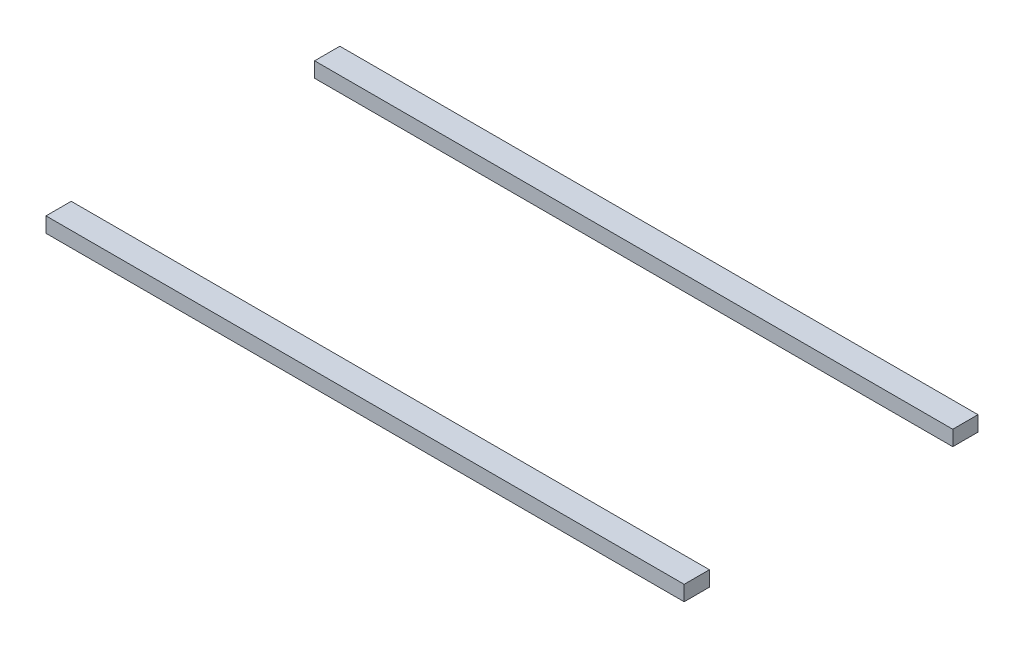
ISO-10303-21;
HEADER;
FILE_DESCRIPTION(('STEP AP214'),'2;1');
FILE_NAME('part.step','',(''),(''),'','','');
FILE_SCHEMA(('AUTOMOTIVE_DESIGN { 1 0 10303 214 1 1 1 1 }'));
ENDSEC;
DATA;
#1=APPLICATION_CONTEXT('core data for automotive mechanical design processes');
#2=APPLICATION_PROTOCOL_DEFINITION('international standard','automotive_design',2000,#1);
#3=PRODUCT_CONTEXT('',#1,'mechanical');
#4=PRODUCT('Part','Part','',(#3));
#5=PRODUCT_RELATED_PRODUCT_CATEGORY('part','',(#4));
#6=PRODUCT_DEFINITION_FORMATION('','',#4);
#7=PRODUCT_DEFINITION_CONTEXT('part definition',#1,'design');
#8=PRODUCT_DEFINITION('design','',#6,#7);
#9=PRODUCT_DEFINITION_SHAPE('','',#8);
#10=(LENGTH_UNIT() NAMED_UNIT(*) SI_UNIT(.MILLI.,.METRE.));
#11=(NAMED_UNIT(*) PLANE_ANGLE_UNIT() SI_UNIT($,.RADIAN.));
#12=(NAMED_UNIT(*) SI_UNIT($,.STERADIAN.) SOLID_ANGLE_UNIT());
#13=UNCERTAINTY_MEASURE_WITH_UNIT(LENGTH_MEASURE(1.E-05),#10,'distance_accuracy_value','');
#14=(GEOMETRIC_REPRESENTATION_CONTEXT(3) GLOBAL_UNCERTAINTY_ASSIGNED_CONTEXT((#13)) GLOBAL_UNIT_ASSIGNED_CONTEXT((#10,
#11,#12)) REPRESENTATION_CONTEXT('',''));
#15=CARTESIAN_POINT('',(0.,0.,0.));
#16=DIRECTION('',(0.,0.,1.));
#17=DIRECTION('',(1.,0.,0.));
#18=AXIS2_PLACEMENT_3D('',#15,#16,#17);
#19=CARTESIAN_POINT('',(0.,30.,-241.));
#20=DIRECTION('',(0.,0.,-1.));
#21=DIRECTION('',(-1.,0.,0.));
#22=AXIS2_PLACEMENT_3D('',#19,#20,#21);
#23=PLANE('',#22);
#24=DIRECTION('',(1.,0.,0.));
#25=VECTOR('',#24,1.);
#26=CARTESIAN_POINT('',(0.,0.,-241.));
#27=LINE('',#26,#25);
#28=CARTESIAN_POINT('',(-632.,0.,-241.));
#29=VERTEX_POINT('',#28);
#30=CARTESIAN_POINT('',(632.,0.,-241.));
#31=VERTEX_POINT('',#30);
#32=EDGE_CURVE('E106',#29,#31,#27,.T.);
#33=ORIENTED_EDGE('',*,*,#32,.T.);
#34=DIRECTION('',(0.,-1.,0.));
#35=VECTOR('',#34,1.);
#36=CARTESIAN_POINT('',(632.,30.,-241.));
#37=LINE('',#36,#35);
#38=CARTESIAN_POINT('',(632.,30.,-241.));
#39=VERTEX_POINT('',#38);
#40=EDGE_CURVE('E12',#39,#31,#37,.T.);
#41=ORIENTED_EDGE('',*,*,#40,.F.);
#42=DIRECTION('',(1.,0.,0.));
#43=VECTOR('',#42,1.);
#44=CARTESIAN_POINT('',(0.,30.,-241.));
#45=LINE('',#44,#43);
#46=CARTESIAN_POINT('',(-632.,30.,-241.));
#47=VERTEX_POINT('',#46);
#48=EDGE_CURVE('E92',#47,#39,#45,.T.);
#49=ORIENTED_EDGE('',*,*,#48,.F.);
#50=DIRECTION('',(0.,-1.,0.));
#51=VECTOR('',#50,1.);
#52=CARTESIAN_POINT('',(-632.,30.,-241.));
#53=LINE('',#52,#51);
#54=EDGE_CURVE('E59',#47,#29,#53,.T.);
#55=ORIENTED_EDGE('',*,*,#54,.T.);
#56=EDGE_LOOP('',(#33,#41,#49,#55));
#57=FACE_BOUND('',#56,.T.);
#58=ADVANCED_FACE('F43',(#57),#23,.F.);
#59=CARTESIAN_POINT('',(632.,30.,0.));
#60=DIRECTION('',(-1.,0.,0.));
#61=DIRECTION('',(0.,0.,1.));
#62=AXIS2_PLACEMENT_3D('',#59,#60,#61);
#63=PLANE('',#62);
#64=DIRECTION('',(0.,0.,-1.));
#65=VECTOR('',#64,1.);
#66=CARTESIAN_POINT('',(632.,0.,0.));
#67=LINE('',#66,#65);
#68=CARTESIAN_POINT('',(632.,0.,-291.));
#69=VERTEX_POINT('',#68);
#70=EDGE_CURVE('E97',#31,#69,#67,.T.);
#71=ORIENTED_EDGE('',*,*,#70,.T.);
#72=DIRECTION('',(0.,-1.,0.));
#73=VECTOR('',#72,1.);
#74=CARTESIAN_POINT('',(632.,30.,-291.));
#75=LINE('',#74,#73);
#76=CARTESIAN_POINT('',(632.,30.,-291.));
#77=VERTEX_POINT('',#76);
#78=EDGE_CURVE('E51',#77,#69,#75,.T.);
#79=ORIENTED_EDGE('',*,*,#78,.F.);
#80=DIRECTION('',(0.,0.,-1.));
#81=VECTOR('',#80,1.);
#82=CARTESIAN_POINT('',(632.,30.,0.));
#83=LINE('',#82,#81);
#84=EDGE_CURVE('E84',#39,#77,#83,.T.);
#85=ORIENTED_EDGE('',*,*,#84,.F.);
#86=ORIENTED_EDGE('',*,*,#40,.T.);
#87=EDGE_LOOP('',(#71,#79,#85,#86));
#88=FACE_BOUND('',#87,.T.);
#89=ADVANCED_FACE('F96',(#88),#63,.F.);
#90=CARTESIAN_POINT('',(0.,30.,-291.));
#91=DIRECTION('',(0.,0.,-1.));
#92=DIRECTION('',(-1.,0.,0.));
#93=AXIS2_PLACEMENT_3D('',#90,#91,#92);
#94=PLANE('',#93);
#95=DIRECTION('',(1.,0.,0.));
#96=VECTOR('',#95,1.);
#97=CARTESIAN_POINT('',(0.,0.,-291.));
#98=LINE('',#97,#96);
#99=CARTESIAN_POINT('',(-632.,0.,-291.));
#100=VERTEX_POINT('',#99);
#101=EDGE_CURVE('E109',#100,#69,#98,.T.);
#102=ORIENTED_EDGE('',*,*,#101,.F.);
#103=DIRECTION('',(0.,-1.,0.));
#104=VECTOR('',#103,1.);
#105=CARTESIAN_POINT('',(-632.,30.,-291.));
#106=LINE('',#105,#104);
#107=CARTESIAN_POINT('',(-632.,30.,-291.));
#108=VERTEX_POINT('',#107);
#109=EDGE_CURVE('E73',#108,#100,#106,.T.);
#110=ORIENTED_EDGE('',*,*,#109,.F.);
#111=DIRECTION('',(1.,0.,0.));
#112=VECTOR('',#111,1.);
#113=CARTESIAN_POINT('',(0.,30.,-291.));
#114=LINE('',#113,#112);
#115=EDGE_CURVE('E91',#108,#77,#114,.T.);
#116=ORIENTED_EDGE('',*,*,#115,.T.);
#117=ORIENTED_EDGE('',*,*,#78,.T.);
#118=EDGE_LOOP('',(#102,#110,#116,#117));
#119=FACE_BOUND('',#118,.T.);
#120=ADVANCED_FACE('F100',(#119),#94,.T.);
#121=CARTESIAN_POINT('',(-632.,30.,0.));
#122=DIRECTION('',(-1.,0.,0.));
#123=DIRECTION('',(0.,0.,1.));
#124=AXIS2_PLACEMENT_3D('',#121,#122,#123);
#125=PLANE('',#124);
#126=DIRECTION('',(0.,0.,-1.));
#127=VECTOR('',#126,1.);
#128=CARTESIAN_POINT('',(-632.,0.,0.));
#129=LINE('',#128,#127);
#130=EDGE_CURVE('E111',#29,#100,#129,.T.);
#131=ORIENTED_EDGE('',*,*,#130,.F.);
#132=ORIENTED_EDGE('',*,*,#54,.F.);
#133=DIRECTION('',(0.,0.,-1.));
#134=VECTOR('',#133,1.);
#135=CARTESIAN_POINT('',(-632.,30.,0.));
#136=LINE('',#135,#134);
#137=EDGE_CURVE('E101',#47,#108,#136,.T.);
#138=ORIENTED_EDGE('',*,*,#137,.T.);
#139=ORIENTED_EDGE('',*,*,#109,.T.);
#140=EDGE_LOOP('',(#131,#132,#138,#139));
#141=FACE_BOUND('',#140,.T.);
#142=ADVANCED_FACE('F117',(#141),#125,.T.);
#143=CARTESIAN_POINT('',(0.,30.,0.));
#144=DIRECTION('',(0.,1.,0.));
#145=DIRECTION('',(0.,0.,1.));
#146=AXIS2_PLACEMENT_3D('',#143,#144,#145);
#147=PLANE('',#146);
#148=ORIENTED_EDGE('',*,*,#48,.T.);
#149=ORIENTED_EDGE('',*,*,#84,.T.);
#150=ORIENTED_EDGE('',*,*,#115,.F.);
#151=ORIENTED_EDGE('',*,*,#137,.F.);
#152=EDGE_LOOP('',(#148,#149,#150,#151));
#153=FACE_BOUND('',#152,.T.);
#154=ADVANCED_FACE('F88',(#153),#147,.T.);
#155=CARTESIAN_POINT('',(0.,0.,0.));
#156=DIRECTION('',(0.,1.,0.));
#157=DIRECTION('',(0.,0.,1.));
#158=AXIS2_PLACEMENT_3D('',#155,#156,#157);
#159=PLANE('',#158);
#160=ORIENTED_EDGE('',*,*,#32,.F.);
#161=ORIENTED_EDGE('',*,*,#130,.T.);
#162=ORIENTED_EDGE('',*,*,#101,.T.);
#163=ORIENTED_EDGE('',*,*,#70,.F.);
#164=EDGE_LOOP('',(#160,#161,#162,#163));
#165=FACE_BOUND('',#164,.T.);
#166=ADVANCED_FACE('F116',(#165),#159,.F.);
#167=CLOSED_SHELL('',(#58,#89,#120,#142,#154,#166));
#168=MANIFOLD_SOLID_BREP('B2',#167);
#169=CARTESIAN_POINT('',(0.,30.,241.));
#170=DIRECTION('',(0.,0.,-1.));
#171=DIRECTION('',(-1.,0.,0.));
#172=AXIS2_PLACEMENT_3D('',#169,#170,#171);
#173=PLANE('',#172);
#174=DIRECTION('',(1.,0.,0.));
#175=VECTOR('',#174,1.);
#176=CARTESIAN_POINT('',(0.,0.,241.));
#177=LINE('',#176,#175);
#178=CARTESIAN_POINT('',(-632.,0.,241.));
#179=VERTEX_POINT('',#178);
#180=CARTESIAN_POINT('',(632.,0.,241.));
#181=VERTEX_POINT('',#180);
#182=EDGE_CURVE('E230',#179,#181,#177,.T.);
#183=ORIENTED_EDGE('',*,*,#182,.F.);
#184=DIRECTION('',(0.,-1.,0.));
#185=VECTOR('',#184,1.);
#186=CARTESIAN_POINT('',(-632.,30.,241.));
#187=LINE('',#186,#185);
#188=CARTESIAN_POINT('',(-632.,30.,241.));
#189=VERTEX_POINT('',#188);
#190=EDGE_CURVE('E41',#189,#179,#187,.T.);
#191=ORIENTED_EDGE('',*,*,#190,.F.);
#192=DIRECTION('',(1.,0.,0.));
#193=VECTOR('',#192,1.);
#194=CARTESIAN_POINT('',(0.,30.,241.));
#195=LINE('',#194,#193);
#196=CARTESIAN_POINT('',(632.,30.,241.));
#197=VERTEX_POINT('',#196);
#198=EDGE_CURVE('E224',#189,#197,#195,.T.);
#199=ORIENTED_EDGE('',*,*,#198,.T.);
#200=DIRECTION('',(0.,-1.,0.));
#201=VECTOR('',#200,1.);
#202=CARTESIAN_POINT('',(632.,30.,241.));
#203=LINE('',#202,#201);
#204=EDGE_CURVE('E205',#197,#181,#203,.T.);
#205=ORIENTED_EDGE('',*,*,#204,.T.);
#206=EDGE_LOOP('',(#183,#191,#199,#205));
#207=FACE_BOUND('',#206,.T.);
#208=ADVANCED_FACE('F167',(#207),#173,.T.);
#209=CARTESIAN_POINT('',(-632.,30.,0.));
#210=DIRECTION('',(-1.,0.,0.));
#211=DIRECTION('',(0.,0.,1.));
#212=AXIS2_PLACEMENT_3D('',#209,#210,#211);
#213=PLANE('',#212);
#214=DIRECTION('',(0.,0.,-1.));
#215=VECTOR('',#214,1.);
#216=CARTESIAN_POINT('',(-632.,0.,0.));
#217=LINE('',#216,#215);
#218=CARTESIAN_POINT('',(-632.,0.,291.));
#219=VERTEX_POINT('',#218);
#220=EDGE_CURVE('E218',#219,#179,#217,.T.);
#221=ORIENTED_EDGE('',*,*,#220,.F.);
#222=DIRECTION('',(0.,-1.,0.));
#223=VECTOR('',#222,1.);
#224=CARTESIAN_POINT('',(-632.,30.,291.));
#225=LINE('',#224,#223);
#226=CARTESIAN_POINT('',(-632.,30.,291.));
#227=VERTEX_POINT('',#226);
#228=EDGE_CURVE('E175',#227,#219,#225,.T.);
#229=ORIENTED_EDGE('',*,*,#228,.F.);
#230=DIRECTION('',(0.,0.,-1.));
#231=VECTOR('',#230,1.);
#232=CARTESIAN_POINT('',(-632.,30.,0.));
#233=LINE('',#232,#231);
#234=EDGE_CURVE('E216',#227,#189,#233,.T.);
#235=ORIENTED_EDGE('',*,*,#234,.T.);
#236=ORIENTED_EDGE('',*,*,#190,.T.);
#237=EDGE_LOOP('',(#221,#229,#235,#236));
#238=FACE_BOUND('',#237,.T.);
#239=ADVANCED_FACE('F214',(#238),#213,.T.);
#240=CARTESIAN_POINT('',(0.,30.,291.));
#241=DIRECTION('',(0.,0.,-1.));
#242=DIRECTION('',(-1.,0.,0.));
#243=AXIS2_PLACEMENT_3D('',#240,#241,#242);
#244=PLANE('',#243);
#245=DIRECTION('',(1.,0.,0.));
#246=VECTOR('',#245,1.);
#247=CARTESIAN_POINT('',(0.,0.,291.));
#248=LINE('',#247,#246);
#249=CARTESIAN_POINT('',(632.,0.,291.));
#250=VERTEX_POINT('',#249);
#251=EDGE_CURVE('E198',#219,#250,#248,.T.);
#252=ORIENTED_EDGE('',*,*,#251,.T.);
#253=DIRECTION('',(0.,-1.,0.));
#254=VECTOR('',#253,1.);
#255=CARTESIAN_POINT('',(632.,30.,291.));
#256=LINE('',#255,#254);
#257=CARTESIAN_POINT('',(632.,30.,291.));
#258=VERTEX_POINT('',#257);
#259=EDGE_CURVE('E219',#258,#250,#256,.T.);
#260=ORIENTED_EDGE('',*,*,#259,.F.);
#261=DIRECTION('',(1.,0.,0.));
#262=VECTOR('',#261,1.);
#263=CARTESIAN_POINT('',(0.,30.,291.));
#264=LINE('',#263,#262);
#265=EDGE_CURVE('E220',#227,#258,#264,.T.);
#266=ORIENTED_EDGE('',*,*,#265,.F.);
#267=ORIENTED_EDGE('',*,*,#228,.T.);
#268=EDGE_LOOP('',(#252,#260,#266,#267));
#269=FACE_BOUND('',#268,.T.);
#270=ADVANCED_FACE('F221',(#269),#244,.F.);
#271=CARTESIAN_POINT('',(632.,30.,0.));
#272=DIRECTION('',(-1.,0.,0.));
#273=DIRECTION('',(0.,0.,1.));
#274=AXIS2_PLACEMENT_3D('',#271,#272,#273);
#275=PLANE('',#274);
#276=DIRECTION('',(0.,0.,-1.));
#277=VECTOR('',#276,1.);
#278=CARTESIAN_POINT('',(632.,0.,0.));
#279=LINE('',#278,#277);
#280=EDGE_CURVE('E226',#250,#181,#279,.T.);
#281=ORIENTED_EDGE('',*,*,#280,.T.);
#282=ORIENTED_EDGE('',*,*,#204,.F.);
#283=DIRECTION('',(0.,0.,-1.));
#284=VECTOR('',#283,1.);
#285=CARTESIAN_POINT('',(632.,30.,0.));
#286=LINE('',#285,#284);
#287=EDGE_CURVE('E183',#258,#197,#286,.T.);
#288=ORIENTED_EDGE('',*,*,#287,.F.);
#289=ORIENTED_EDGE('',*,*,#259,.T.);
#290=EDGE_LOOP('',(#281,#282,#288,#289));
#291=FACE_BOUND('',#290,.T.);
#292=ADVANCED_FACE('F239',(#291),#275,.F.);
#293=CARTESIAN_POINT('',(0.,30.,0.));
#294=DIRECTION('',(0.,1.,0.));
#295=DIRECTION('',(0.,0.,1.));
#296=AXIS2_PLACEMENT_3D('',#293,#294,#295);
#297=PLANE('',#296);
#298=ORIENTED_EDGE('',*,*,#198,.F.);
#299=ORIENTED_EDGE('',*,*,#234,.F.);
#300=ORIENTED_EDGE('',*,*,#265,.T.);
#301=ORIENTED_EDGE('',*,*,#287,.T.);
#302=EDGE_LOOP('',(#298,#299,#300,#301));
#303=FACE_BOUND('',#302,.T.);
#304=ADVANCED_FACE('F223',(#303),#297,.T.);
#305=CARTESIAN_POINT('',(0.,0.,0.));
#306=DIRECTION('',(0.,1.,0.));
#307=DIRECTION('',(0.,0.,1.));
#308=AXIS2_PLACEMENT_3D('',#305,#306,#307);
#309=PLANE('',#308);
#310=ORIENTED_EDGE('',*,*,#182,.T.);
#311=ORIENTED_EDGE('',*,*,#280,.F.);
#312=ORIENTED_EDGE('',*,*,#251,.F.);
#313=ORIENTED_EDGE('',*,*,#220,.T.);
#314=EDGE_LOOP('',(#310,#311,#312,#313));
#315=FACE_BOUND('',#314,.T.);
#316=ADVANCED_FACE('F241',(#315),#309,.F.);
#317=CLOSED_SHELL('',(#208,#239,#270,#292,#304,#316));
#318=MANIFOLD_SOLID_BREP('B6',#317);
#319=ADVANCED_BREP_SHAPE_REPRESENTATION('',(#18,#168,#318),#14);
#320=SHAPE_DEFINITION_REPRESENTATION(#9,#319);
ENDSEC;
END-ISO-10303-21;
